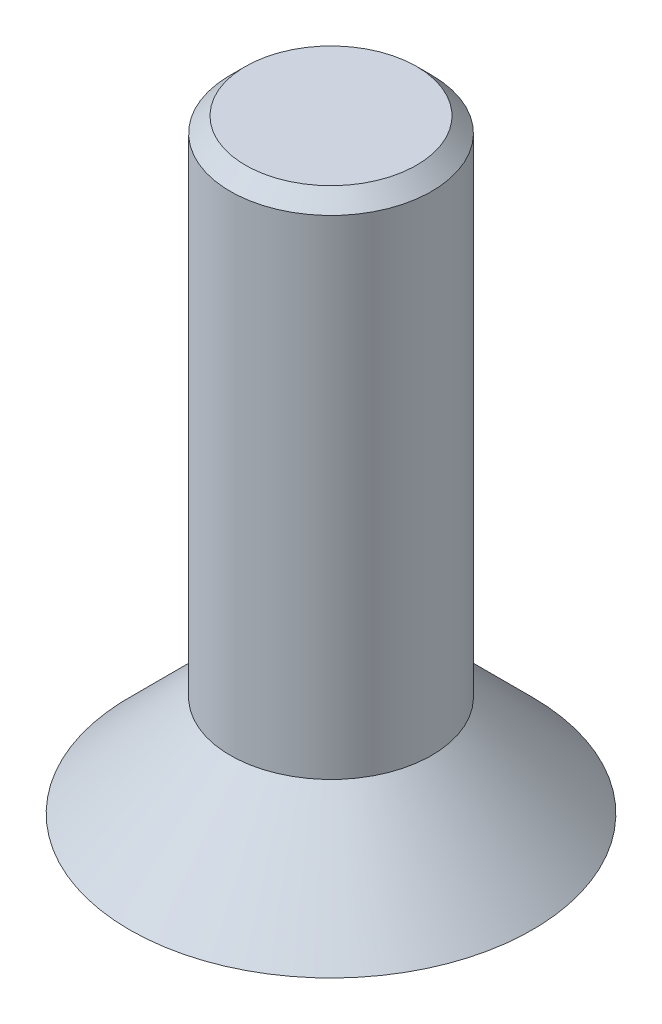
ISO-10303-21;
HEADER;
FILE_DESCRIPTION(('STEP AP214'),'2;1');
FILE_NAME('part.step','',(''),(''),'','','');
FILE_SCHEMA(('AUTOMOTIVE_DESIGN { 1 0 10303 214 1 1 1 1 }'));
ENDSEC;
DATA;
#1=APPLICATION_CONTEXT('core data for automotive mechanical design processes');
#2=APPLICATION_PROTOCOL_DEFINITION('international standard','automotive_design',2000,#1);
#3=PRODUCT_CONTEXT('',#1,'mechanical');
#4=PRODUCT('Part','Part','',(#3));
#5=PRODUCT_RELATED_PRODUCT_CATEGORY('part','',(#4));
#6=PRODUCT_DEFINITION_FORMATION('','',#4);
#7=PRODUCT_DEFINITION_CONTEXT('part definition',#1,'design');
#8=PRODUCT_DEFINITION('design','',#6,#7);
#9=PRODUCT_DEFINITION_SHAPE('','',#8);
#10=(LENGTH_UNIT() NAMED_UNIT(*) SI_UNIT(.MILLI.,.METRE.));
#11=(NAMED_UNIT(*) PLANE_ANGLE_UNIT() SI_UNIT($,.RADIAN.));
#12=(NAMED_UNIT(*) SI_UNIT($,.STERADIAN.) SOLID_ANGLE_UNIT());
#13=UNCERTAINTY_MEASURE_WITH_UNIT(LENGTH_MEASURE(1.E-05),#10,'distance_accuracy_value','');
#14=(GEOMETRIC_REPRESENTATION_CONTEXT(3) GLOBAL_UNCERTAINTY_ASSIGNED_CONTEXT((#13)) GLOBAL_UNIT_ASSIGNED_CONTEXT((#10,
#11,#12)) REPRESENTATION_CONTEXT('',''));
#15=CARTESIAN_POINT('',(0.,0.,0.));
#16=DIRECTION('',(0.,0.,1.));
#17=DIRECTION('',(1.,0.,0.));
#18=AXIS2_PLACEMENT_3D('',#15,#16,#17);
#19=CARTESIAN_POINT('',(0.,0.,0.));
#20=DIRECTION('',(0.,-1.,0.));
#21=DIRECTION('',(0.,0.,-1.));
#22=AXIS2_PLACEMENT_3D('',#19,#20,#21);
#23=PLANE('',#22);
#24=DIRECTION('',(0.5,0.,0.866025403784439));
#25=VECTOR('',#24,1.);
#26=CARTESIAN_POINT('',(0.721687836487032,0.,-1.25));
#27=LINE('',#26,#25);
#28=CARTESIAN_POINT('',(0.721687836487032,0.,-1.25));
#29=VERTEX_POINT('',#28);
#30=CARTESIAN_POINT('',(1.44337567297406,0.,0.));
#31=VERTEX_POINT('',#30);
#32=EDGE_CURVE('E58',#29,#31,#27,.T.);
#33=ORIENTED_EDGE('',*,*,#32,.F.);
#34=DIRECTION('',(1.,0.,0.));
#35=VECTOR('',#34,1.);
#36=CARTESIAN_POINT('',(-0.721687836487033,0.,-1.25));
#37=LINE('',#36,#35);
#38=CARTESIAN_POINT('',(-0.721687836487033,0.,-1.25));
#39=VERTEX_POINT('',#38);
#40=EDGE_CURVE('E153',#39,#29,#37,.T.);
#41=ORIENTED_EDGE('',*,*,#40,.F.);
#42=DIRECTION('',(0.5,0.,-0.866025403784439));
#43=VECTOR('',#42,1.);
#44=CARTESIAN_POINT('',(-1.44337567297406,0.,0.));
#45=LINE('',#44,#43);
#46=CARTESIAN_POINT('',(-1.44337567297406,0.,0.));
#47=VERTEX_POINT('',#46);
#48=EDGE_CURVE('E147',#47,#39,#45,.T.);
#49=ORIENTED_EDGE('',*,*,#48,.F.);
#50=DIRECTION('',(-0.5,0.,-0.866025403784439));
#51=VECTOR('',#50,1.);
#52=CARTESIAN_POINT('',(-0.721687836487032,0.,1.25));
#53=LINE('',#52,#51);
#54=CARTESIAN_POINT('',(-0.721687836487032,0.,1.25));
#55=VERTEX_POINT('',#54);
#56=EDGE_CURVE('E107',#55,#47,#53,.T.);
#57=ORIENTED_EDGE('',*,*,#56,.F.);
#58=DIRECTION('',(-1.,0.,0.));
#59=VECTOR('',#58,1.);
#60=CARTESIAN_POINT('',(0.721687836487032,0.,1.25));
#61=LINE('',#60,#59);
#62=CARTESIAN_POINT('',(0.721687836487032,0.,1.25));
#63=VERTEX_POINT('',#62);
#64=EDGE_CURVE('E145',#63,#55,#61,.T.);
#65=ORIENTED_EDGE('',*,*,#64,.F.);
#66=DIRECTION('',(-0.5,0.,0.866025403784439));
#67=VECTOR('',#66,1.);
#68=CARTESIAN_POINT('',(1.44337567297406,0.,0.));
#69=LINE('',#68,#67);
#70=EDGE_CURVE('E138',#31,#63,#69,.T.);
#71=ORIENTED_EDGE('',*,*,#70,.F.);
#72=EDGE_LOOP('',(#33,#41,#49,#57,#65,#71));
#73=FACE_BOUND('',#72,.T.);
#74=CARTESIAN_POINT('',(0.,0.,0.));
#75=DIRECTION('',(0.,-1.,0.));
#76=DIRECTION('',(0.,0.,-1.));
#77=AXIS2_PLACEMENT_3D('',#74,#75,#76);
#78=CIRCLE('',#77,4.);
#79=CARTESIAN_POINT('',(0.,0.,-4.));
#80=VERTEX_POINT('',#79);
#81=EDGE_CURVE('E11',#80,#80,#78,.T.);
#82=ORIENTED_EDGE('',*,*,#81,.T.);
#83=EDGE_LOOP('',(#82));
#84=FACE_BOUND('',#83,.T.);
#85=ADVANCED_FACE('F44',(#73,#84),#23,.T.);
#86=CARTESIAN_POINT('',(0.,0.,0.));
#87=DIRECTION('',(0.,-1.,0.));
#88=DIRECTION('',(0.,0.,-1.));
#89=AXIS2_PLACEMENT_3D('',#86,#87,#88);
#90=CONICAL_SURFACE('',#89,4.,0.785398163397448);
#91=CARTESIAN_POINT('',(0.,2.,0.));
#92=DIRECTION('',(0.,-1.,0.));
#93=DIRECTION('',(0.,0.,-1.));
#94=AXIS2_PLACEMENT_3D('',#91,#92,#93);
#95=CIRCLE('',#94,2.);
#96=CARTESIAN_POINT('',(0.,2.,-2.));
#97=VERTEX_POINT('',#96);
#98=EDGE_CURVE('E52',#97,#97,#95,.T.);
#99=ORIENTED_EDGE('',*,*,#98,.T.);
#100=EDGE_LOOP('',(#99));
#101=FACE_BOUND('',#100,.T.);
#102=ORIENTED_EDGE('',*,*,#81,.F.);
#103=EDGE_LOOP('',(#102));
#104=FACE_BOUND('',#103,.T.);
#105=ADVANCED_FACE('F176',(#101,#104),#90,.T.);
#106=CARTESIAN_POINT('',(0.,-2.,0.));
#107=DIRECTION('',(0.,-1.,0.));
#108=DIRECTION('',(0.,0.,-1.));
#109=AXIS2_PLACEMENT_3D('',#106,#107,#108);
#110=CYLINDRICAL_SURFACE('',#109,2.);
#111=CARTESIAN_POINT('',(0.,11.7,0.));
#112=DIRECTION('',(0.,-1.,0.));
#113=DIRECTION('',(0.,0.,-1.));
#114=AXIS2_PLACEMENT_3D('',#111,#112,#113);
#115=CIRCLE('',#114,2.);
#116=CARTESIAN_POINT('',(0.,11.7,-2.));
#117=VERTEX_POINT('',#116);
#118=EDGE_CURVE('E174',#117,#117,#115,.T.);
#119=ORIENTED_EDGE('',*,*,#118,.T.);
#120=EDGE_LOOP('',(#119));
#121=FACE_BOUND('',#120,.T.);
#122=ORIENTED_EDGE('',*,*,#98,.F.);
#123=EDGE_LOOP('',(#122));
#124=FACE_BOUND('',#123,.T.);
#125=ADVANCED_FACE('F185',(#121,#124),#110,.T.);
#126=CARTESIAN_POINT('',(0.,11.7,0.));
#127=DIRECTION('',(0.,-1.,0.));
#128=DIRECTION('',(0.,0.,-1.));
#129=AXIS2_PLACEMENT_3D('',#126,#127,#128);
#130=CONICAL_SURFACE('',#129,2.,0.785398163397446);
#131=CARTESIAN_POINT('',(0.,12.,0.));
#132=DIRECTION('',(0.,-1.,0.));
#133=DIRECTION('',(0.,0.,-1.));
#134=AXIS2_PLACEMENT_3D('',#131,#132,#133);
#135=CIRCLE('',#134,1.7);
#136=CARTESIAN_POINT('',(0.,12.,-1.7));
#137=VERTEX_POINT('',#136);
#138=EDGE_CURVE('E157',#137,#137,#135,.T.);
#139=ORIENTED_EDGE('',*,*,#138,.T.);
#140=EDGE_LOOP('',(#139));
#141=FACE_BOUND('',#140,.T.);
#142=ORIENTED_EDGE('',*,*,#118,.F.);
#143=EDGE_LOOP('',(#142));
#144=FACE_BOUND('',#143,.T.);
#145=ADVANCED_FACE('F184',(#141,#144),#130,.T.);
#146=CARTESIAN_POINT('',(1.7,12.,0.));
#147=DIRECTION('',(0.,1.,0.));
#148=DIRECTION('',(0.,0.,1.));
#149=AXIS2_PLACEMENT_3D('',#146,#147,#148);
#150=PLANE('',#149);
#151=ORIENTED_EDGE('',*,*,#138,.F.);
#152=EDGE_LOOP('',(#151));
#153=FACE_BOUND('',#152,.T.);
#154=ADVANCED_FACE('F192',(#153),#150,.T.);
#155=CARTESIAN_POINT('',(0.721687836487032,1.5,-1.25));
#156=DIRECTION('',(0.866025403784439,0.,-0.5));
#157=DIRECTION('',(-0.5,0.,-0.866025403784439));
#158=AXIS2_PLACEMENT_3D('',#155,#156,#157);
#159=PLANE('',#158);
#160=ORIENTED_EDGE('',*,*,#32,.T.);
#161=DIRECTION('',(0.,-1.,0.));
#162=VECTOR('',#161,1.);
#163=CARTESIAN_POINT('',(1.44337567297406,1.5,0.));
#164=LINE('',#163,#162);
#165=CARTESIAN_POINT('',(1.44337567297406,1.5,0.));
#166=VERTEX_POINT('',#165);
#167=EDGE_CURVE('E89',#166,#31,#164,.T.);
#168=ORIENTED_EDGE('',*,*,#167,.F.);
#169=DIRECTION('',(0.5,0.,0.866025403784439));
#170=VECTOR('',#169,1.);
#171=CARTESIAN_POINT('',(0.721687836487032,1.5,-1.25));
#172=LINE('',#171,#170);
#173=CARTESIAN_POINT('',(0.721687836487032,1.5,-1.25));
#174=VERTEX_POINT('',#173);
#175=EDGE_CURVE('E156',#174,#166,#172,.T.);
#176=ORIENTED_EDGE('',*,*,#175,.F.);
#177=DIRECTION('',(0.,-1.,0.));
#178=VECTOR('',#177,1.);
#179=CARTESIAN_POINT('',(0.721687836487032,1.5,-1.25));
#180=LINE('',#179,#178);
#181=EDGE_CURVE('E70',#174,#29,#180,.T.);
#182=ORIENTED_EDGE('',*,*,#181,.T.);
#183=EDGE_LOOP('',(#160,#168,#176,#182));
#184=FACE_BOUND('',#183,.T.);
#185=ADVANCED_FACE('F209',(#184),#159,.F.);
#186=CARTESIAN_POINT('',(-0.721687836487033,1.5,-1.25));
#187=DIRECTION('',(0.,0.,-1.));
#188=DIRECTION('',(-1.,0.,0.));
#189=AXIS2_PLACEMENT_3D('',#186,#187,#188);
#190=PLANE('',#189);
#191=ORIENTED_EDGE('',*,*,#40,.T.);
#192=ORIENTED_EDGE('',*,*,#181,.F.);
#193=DIRECTION('',(1.,0.,0.));
#194=VECTOR('',#193,1.);
#195=CARTESIAN_POINT('',(-0.721687836487033,1.5,-1.25));
#196=LINE('',#195,#194);
#197=CARTESIAN_POINT('',(-0.721687836487033,1.5,-1.25));
#198=VERTEX_POINT('',#197);
#199=EDGE_CURVE('E124',#198,#174,#196,.T.);
#200=ORIENTED_EDGE('',*,*,#199,.F.);
#201=DIRECTION('',(0.,-1.,0.));
#202=VECTOR('',#201,1.);
#203=CARTESIAN_POINT('',(-0.721687836487033,1.5,-1.25));
#204=LINE('',#203,#202);
#205=EDGE_CURVE('E114',#198,#39,#204,.T.);
#206=ORIENTED_EDGE('',*,*,#205,.T.);
#207=EDGE_LOOP('',(#191,#192,#200,#206));
#208=FACE_BOUND('',#207,.T.);
#209=ADVANCED_FACE('F211',(#208),#190,.F.);
#210=CARTESIAN_POINT('',(-1.44337567297406,1.5,0.));
#211=DIRECTION('',(-0.866025403784439,0.,-0.5));
#212=DIRECTION('',(-0.5,0.,0.866025403784439));
#213=AXIS2_PLACEMENT_3D('',#210,#211,#212);
#214=PLANE('',#213);
#215=ORIENTED_EDGE('',*,*,#48,.T.);
#216=ORIENTED_EDGE('',*,*,#205,.F.);
#217=DIRECTION('',(0.5,0.,-0.866025403784439));
#218=VECTOR('',#217,1.);
#219=CARTESIAN_POINT('',(-1.44337567297406,1.5,0.));
#220=LINE('',#219,#218);
#221=CARTESIAN_POINT('',(-1.44337567297406,1.5,0.));
#222=VERTEX_POINT('',#221);
#223=EDGE_CURVE('E119',#222,#198,#220,.T.);
#224=ORIENTED_EDGE('',*,*,#223,.F.);
#225=DIRECTION('',(0.,-1.,0.));
#226=VECTOR('',#225,1.);
#227=CARTESIAN_POINT('',(-1.44337567297406,1.5,0.));
#228=LINE('',#227,#226);
#229=EDGE_CURVE('E101',#222,#47,#228,.T.);
#230=ORIENTED_EDGE('',*,*,#229,.T.);
#231=EDGE_LOOP('',(#215,#216,#224,#230));
#232=FACE_BOUND('',#231,.T.);
#233=ADVANCED_FACE('F117',(#232),#214,.F.);
#234=CARTESIAN_POINT('',(-0.721687836487032,1.5,1.25));
#235=DIRECTION('',(-0.866025403784438,0.,0.5));
#236=DIRECTION('',(0.5,0.,0.866025403784439));
#237=AXIS2_PLACEMENT_3D('',#234,#235,#236);
#238=PLANE('',#237);
#239=ORIENTED_EDGE('',*,*,#56,.T.);
#240=ORIENTED_EDGE('',*,*,#229,.F.);
#241=DIRECTION('',(-0.5,0.,-0.866025403784439));
#242=VECTOR('',#241,1.);
#243=CARTESIAN_POINT('',(-0.721687836487032,1.5,1.25));
#244=LINE('',#243,#242);
#245=CARTESIAN_POINT('',(-0.721687836487032,1.5,1.25));
#246=VERTEX_POINT('',#245);
#247=EDGE_CURVE('E104',#246,#222,#244,.T.);
#248=ORIENTED_EDGE('',*,*,#247,.F.);
#249=DIRECTION('',(0.,-1.,0.));
#250=VECTOR('',#249,1.);
#251=CARTESIAN_POINT('',(-0.721687836487032,1.5,1.25));
#252=LINE('',#251,#250);
#253=EDGE_CURVE('E111',#246,#55,#252,.T.);
#254=ORIENTED_EDGE('',*,*,#253,.T.);
#255=EDGE_LOOP('',(#239,#240,#248,#254));
#256=FACE_BOUND('',#255,.T.);
#257=ADVANCED_FACE('F103',(#256),#238,.F.);
#258=CARTESIAN_POINT('',(0.721687836487032,1.5,1.25));
#259=DIRECTION('',(0.,0.,1.));
#260=DIRECTION('',(1.,0.,0.));
#261=AXIS2_PLACEMENT_3D('',#258,#259,#260);
#262=PLANE('',#261);
#263=ORIENTED_EDGE('',*,*,#64,.T.);
#264=ORIENTED_EDGE('',*,*,#253,.F.);
#265=DIRECTION('',(-1.,0.,0.));
#266=VECTOR('',#265,1.);
#267=CARTESIAN_POINT('',(0.721687836487032,1.5,1.25));
#268=LINE('',#267,#266);
#269=CARTESIAN_POINT('',(0.721687836487032,1.5,1.25));
#270=VERTEX_POINT('',#269);
#271=EDGE_CURVE('E126',#270,#246,#268,.T.);
#272=ORIENTED_EDGE('',*,*,#271,.F.);
#273=DIRECTION('',(0.,-1.,0.));
#274=VECTOR('',#273,1.);
#275=CARTESIAN_POINT('',(0.721687836487032,1.5,1.25));
#276=LINE('',#275,#274);
#277=EDGE_CURVE('E163',#270,#63,#276,.T.);
#278=ORIENTED_EDGE('',*,*,#277,.T.);
#279=EDGE_LOOP('',(#263,#264,#272,#278));
#280=FACE_BOUND('',#279,.T.);
#281=ADVANCED_FACE('F225',(#280),#262,.F.);
#282=CARTESIAN_POINT('',(1.44337567297406,1.5,0.));
#283=DIRECTION('',(0.866025403784439,0.,0.5));
#284=DIRECTION('',(0.5,0.,-0.866025403784439));
#285=AXIS2_PLACEMENT_3D('',#282,#283,#284);
#286=PLANE('',#285);
#287=ORIENTED_EDGE('',*,*,#70,.T.);
#288=ORIENTED_EDGE('',*,*,#277,.F.);
#289=DIRECTION('',(-0.5,0.,0.866025403784439));
#290=VECTOR('',#289,1.);
#291=CARTESIAN_POINT('',(1.44337567297406,1.5,0.));
#292=LINE('',#291,#290);
#293=EDGE_CURVE('E134',#166,#270,#292,.T.);
#294=ORIENTED_EDGE('',*,*,#293,.F.);
#295=ORIENTED_EDGE('',*,*,#167,.T.);
#296=EDGE_LOOP('',(#287,#288,#294,#295));
#297=FACE_BOUND('',#296,.T.);
#298=ADVANCED_FACE('F206',(#297),#286,.F.);
#299=CARTESIAN_POINT('',(0.,1.5,0.));
#300=DIRECTION('',(0.,-1.,0.));
#301=DIRECTION('',(0.,0.,-1.));
#302=AXIS2_PLACEMENT_3D('',#299,#300,#301);
#303=PLANE('',#302);
#304=ORIENTED_EDGE('',*,*,#175,.T.);
#305=ORIENTED_EDGE('',*,*,#293,.T.);
#306=ORIENTED_EDGE('',*,*,#271,.T.);
#307=ORIENTED_EDGE('',*,*,#247,.T.);
#308=ORIENTED_EDGE('',*,*,#223,.T.);
#309=ORIENTED_EDGE('',*,*,#199,.T.);
#310=EDGE_LOOP('',(#304,#305,#306,#307,#308,#309));
#311=FACE_BOUND('',#310,.T.);
#312=ADVANCED_FACE('F123',(#311),#303,.T.);
#313=CLOSED_SHELL('',(#85,#105,#125,#145,#154,#185,#209,#233,#257,#281,#298,#312));
#314=MANIFOLD_SOLID_BREP('B2',#313);
#315=ADVANCED_BREP_SHAPE_REPRESENTATION('',(#18,#314),#14);
#316=SHAPE_DEFINITION_REPRESENTATION(#9,#315);
ENDSEC;
END-ISO-10303-21;
